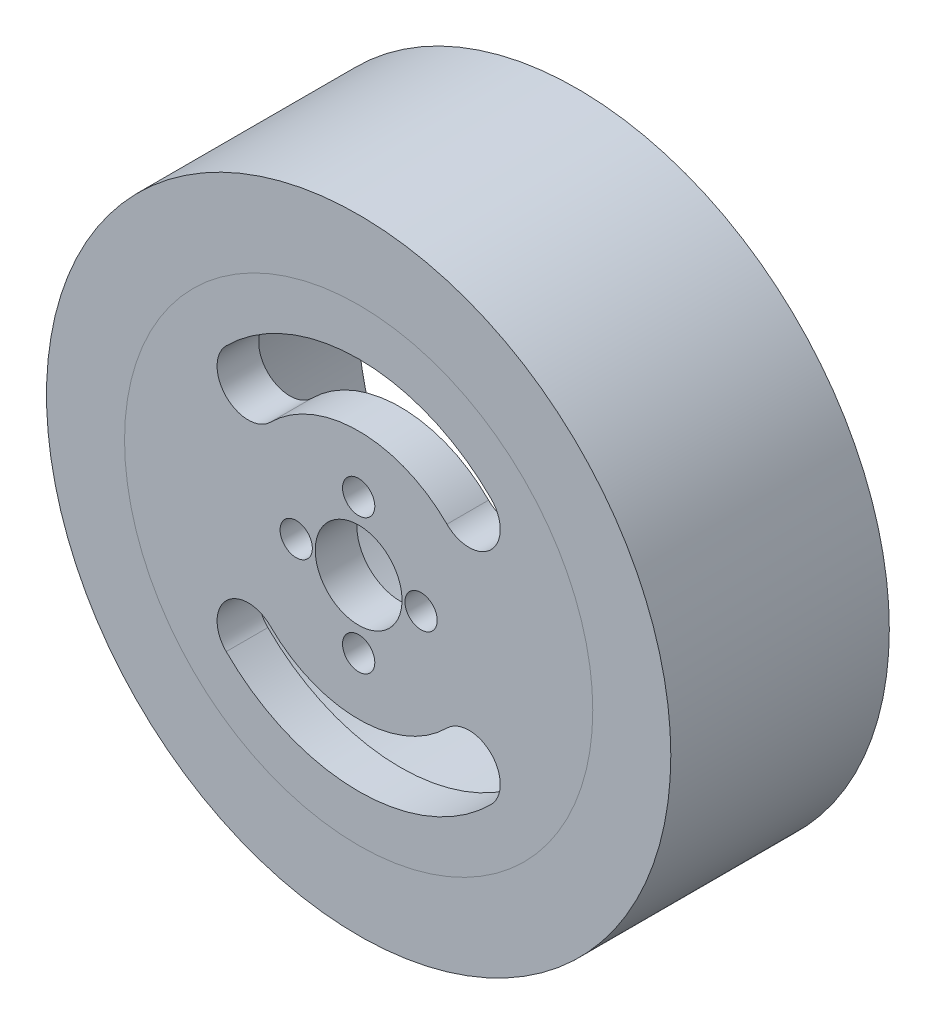
ISO-10303-21;
HEADER;
FILE_DESCRIPTION(('STEP AP214'),'2;1');
FILE_NAME('part.step','',(''),(''),'','','');
FILE_SCHEMA(('AUTOMOTIVE_DESIGN { 1 0 10303 214 1 1 1 1 }'));
ENDSEC;
DATA;
#1=APPLICATION_CONTEXT('core data for automotive mechanical design processes');
#2=APPLICATION_PROTOCOL_DEFINITION('international standard','automotive_design',2000,#1);
#3=PRODUCT_CONTEXT('',#1,'mechanical');
#4=PRODUCT('Part','Part','',(#3));
#5=PRODUCT_RELATED_PRODUCT_CATEGORY('part','',(#4));
#6=PRODUCT_DEFINITION_FORMATION('','',#4);
#7=PRODUCT_DEFINITION_CONTEXT('part definition',#1,'design');
#8=PRODUCT_DEFINITION('design','',#6,#7);
#9=PRODUCT_DEFINITION_SHAPE('','',#8);
#10=(LENGTH_UNIT() NAMED_UNIT(*) SI_UNIT(.MILLI.,.METRE.));
#11=(NAMED_UNIT(*) PLANE_ANGLE_UNIT() SI_UNIT($,.RADIAN.));
#12=(NAMED_UNIT(*) SI_UNIT($,.STERADIAN.) SOLID_ANGLE_UNIT());
#13=UNCERTAINTY_MEASURE_WITH_UNIT(LENGTH_MEASURE(1.E-05),#10,'distance_accuracy_value','');
#14=(GEOMETRIC_REPRESENTATION_CONTEXT(3) GLOBAL_UNCERTAINTY_ASSIGNED_CONTEXT((#13)) GLOBAL_UNIT_ASSIGNED_CONTEXT((#10,
#11,#12)) REPRESENTATION_CONTEXT('',''));
#15=CARTESIAN_POINT('',(0.,0.,0.));
#16=DIRECTION('',(0.,0.,1.));
#17=DIRECTION('',(1.,0.,0.));
#18=AXIS2_PLACEMENT_3D('',#15,#16,#17);
#19=CARTESIAN_POINT('',(0.,0.,-84.8528137423857));
#20=DIRECTION('',(0.,0.,1.));
#21=DIRECTION('',(1.,0.,0.));
#22=AXIS2_PLACEMENT_3D('',#19,#20,#21);
#23=CYLINDRICAL_SURFACE('',#22,30.);
#24=CARTESIAN_POINT('',(0.,0.,0.));
#25=DIRECTION('',(0.,0.,1.));
#26=DIRECTION('',(1.,0.,0.));
#27=AXIS2_PLACEMENT_3D('',#24,#25,#26);
#28=CIRCLE('',#27,30.);
#29=CARTESIAN_POINT('',(30.,0.,0.));
#30=VERTEX_POINT('',#29);
#31=EDGE_CURVE('E80',#30,#30,#28,.F.);
#32=ORIENTED_EDGE('',*,*,#31,.F.);
#33=EDGE_LOOP('',(#32));
#34=FACE_BOUND('',#33,.T.);
#35=CARTESIAN_POINT('',(0.,0.,21.));
#36=DIRECTION('',(0.,0.,1.));
#37=DIRECTION('',(1.,0.,0.));
#38=AXIS2_PLACEMENT_3D('',#35,#36,#37);
#39=CIRCLE('',#38,30.);
#40=CARTESIAN_POINT('',(30.,0.,21.));
#41=VERTEX_POINT('',#40);
#42=EDGE_CURVE('E84',#41,#41,#39,.T.);
#43=ORIENTED_EDGE('',*,*,#42,.F.);
#44=EDGE_LOOP('',(#43));
#45=FACE_BOUND('',#44,.T.);
#46=ADVANCED_FACE('F74',(#34,#45),#23,.T.);
#47=CARTESIAN_POINT('',(0.,0.,21.));
#48=DIRECTION('',(0.,0.,1.));
#49=DIRECTION('',(1.,0.,0.));
#50=AXIS2_PLACEMENT_3D('',#47,#48,#49);
#51=PLANE('',#50);
#52=CARTESIAN_POINT('',(0.,0.,21.));
#53=DIRECTION('',(0.,0.,1.));
#54=DIRECTION('',(1.,0.,0.));
#55=AXIS2_PLACEMENT_3D('',#52,#53,#54);
#56=CIRCLE('',#55,22.5);
#57=CARTESIAN_POINT('',(22.5,0.,21.));
#58=VERTEX_POINT('',#57);
#59=EDGE_CURVE('E89',#58,#58,#56,.T.);
#60=ORIENTED_EDGE('',*,*,#59,.F.);
#61=EDGE_LOOP('',(#60));
#62=FACE_BOUND('',#61,.T.);
#63=ORIENTED_EDGE('',*,*,#42,.T.);
#64=EDGE_LOOP('',(#63));
#65=FACE_BOUND('',#64,.T.);
#66=ADVANCED_FACE('F96',(#62,#65),#51,.T.);
#67=CARTESIAN_POINT('',(0.,0.,-84.8528137423857));
#68=DIRECTION('',(0.,0.,1.));
#69=DIRECTION('',(1.,0.,0.));
#70=AXIS2_PLACEMENT_3D('',#67,#68,#69);
#71=CYLINDRICAL_SURFACE('',#70,22.5);
#72=CARTESIAN_POINT('',(0.,0.,0.));
#73=DIRECTION('',(0.,0.,1.));
#74=DIRECTION('',(1.,0.,0.));
#75=AXIS2_PLACEMENT_3D('',#72,#73,#74);
#76=CIRCLE('',#75,22.5);
#77=CARTESIAN_POINT('',(22.5,0.,0.));
#78=VERTEX_POINT('',#77);
#79=EDGE_CURVE('E12',#78,#78,#76,.F.);
#80=ORIENTED_EDGE('',*,*,#79,.T.);
#81=EDGE_LOOP('',(#80));
#82=FACE_BOUND('',#81,.T.);
#83=ORIENTED_EDGE('',*,*,#59,.T.);
#84=EDGE_LOOP('',(#83));
#85=FACE_BOUND('',#84,.T.);
#86=ADVANCED_FACE('F94',(#82,#85),#71,.F.);
#87=CARTESIAN_POINT('',(0.,0.,0.));
#88=DIRECTION('',(0.,0.,1.));
#89=DIRECTION('',(1.,0.,0.));
#90=AXIS2_PLACEMENT_3D('',#87,#88,#89);
#91=PLANE('',#90);
#92=ORIENTED_EDGE('',*,*,#31,.T.);
#93=EDGE_LOOP('',(#92));
#94=FACE_BOUND('',#93,.T.);
#95=ORIENTED_EDGE('',*,*,#79,.F.);
#96=EDGE_LOOP('',(#95));
#97=FACE_BOUND('',#96,.T.);
#98=ADVANCED_FACE('F115',(#94,#97),#91,.F.);
#99=CLOSED_SHELL('',(#46,#66,#86,#98));
#100=MANIFOLD_SOLID_BREP('B2',#99);
#101=CARTESIAN_POINT('',(0.,0.,21.));
#102=DIRECTION('',(0.,0.,1.));
#103=DIRECTION('',(1.,0.,0.));
#104=AXIS2_PLACEMENT_3D('',#101,#102,#103);
#105=PLANE('',#104);
#106=CARTESIAN_POINT('',(0.,-6.5,21.));
#107=DIRECTION('',(0.,0.,-1.));
#108=DIRECTION('',(-1.,0.,0.));
#109=AXIS2_PLACEMENT_3D('',#106,#107,#108);
#110=CIRCLE('',#109,1.55);
#111=CARTESIAN_POINT('',(-1.55,-6.5,21.));
#112=VERTEX_POINT('',#111);
#113=EDGE_CURVE('E241',#112,#112,#110,.T.);
#114=ORIENTED_EDGE('',*,*,#113,.T.);
#115=EDGE_LOOP('',(#114));
#116=FACE_BOUND('',#115,.T.);
#117=CARTESIAN_POINT('',(0.,0.,21.));
#118=DIRECTION('',(0.,0.,-1.));
#119=DIRECTION('',(-1.,0.,0.));
#120=AXIS2_PLACEMENT_3D('',#117,#118,#119);
#121=CIRCLE('',#120,4.17);
#122=CARTESIAN_POINT('',(-4.17,0.,21.));
#123=VERTEX_POINT('',#122);
#124=EDGE_CURVE('E262',#123,#123,#121,.T.);
#125=ORIENTED_EDGE('',*,*,#124,.T.);
#126=EDGE_LOOP('',(#125));
#127=FACE_BOUND('',#126,.T.);
#128=CARTESIAN_POINT('',(-6.,0.,21.));
#129=DIRECTION('',(0.,0.,-1.));
#130=DIRECTION('',(-1.,0.,0.));
#131=AXIS2_PLACEMENT_3D('',#128,#129,#130);
#132=CIRCLE('',#131,1.55);
#133=CARTESIAN_POINT('',(-7.55,0.,21.));
#134=VERTEX_POINT('',#133);
#135=EDGE_CURVE('E380',#134,#134,#132,.T.);
#136=ORIENTED_EDGE('',*,*,#135,.T.);
#137=EDGE_LOOP('',(#136));
#138=FACE_BOUND('',#137,.T.);
#139=CARTESIAN_POINT('',(0.,6.5,21.));
#140=DIRECTION('',(0.,0.,-1.));
#141=DIRECTION('',(-1.,0.,0.));
#142=AXIS2_PLACEMENT_3D('',#139,#140,#141);
#143=CIRCLE('',#142,1.55);
#144=CARTESIAN_POINT('',(-1.55,6.5,21.));
#145=VERTEX_POINT('',#144);
#146=EDGE_CURVE('E363',#145,#145,#143,.T.);
#147=ORIENTED_EDGE('',*,*,#146,.T.);
#148=EDGE_LOOP('',(#147));
#149=FACE_BOUND('',#148,.T.);
#150=CARTESIAN_POINT('',(6.,0.,21.));
#151=DIRECTION('',(0.,0.,-1.));
#152=DIRECTION('',(-1.,0.,0.));
#153=AXIS2_PLACEMENT_3D('',#150,#151,#152);
#154=CIRCLE('',#153,1.55);
#155=CARTESIAN_POINT('',(4.45,0.,21.));
#156=VERTEX_POINT('',#155);
#157=EDGE_CURVE('E368',#156,#156,#154,.T.);
#158=ORIENTED_EDGE('',*,*,#157,.T.);
#159=EDGE_LOOP('',(#158));
#160=FACE_BOUND('',#159,.T.);
#161=CARTESIAN_POINT('',(0.,0.,21.));
#162=DIRECTION('',(0.,0.,1.));
#163=DIRECTION('',(1.,0.,0.));
#164=AXIS2_PLACEMENT_3D('',#161,#162,#163);
#165=CIRCLE('',#164,22.5);
#166=CARTESIAN_POINT('',(-22.5,0.,21.));
#167=VERTEX_POINT('',#166);
#168=EDGE_CURVE('E72',#167,#167,#165,.T.);
#169=ORIENTED_EDGE('',*,*,#168,.T.);
#170=EDGE_LOOP('',(#169));
#171=FACE_BOUND('',#170,.T.);
#172=CARTESIAN_POINT('',(-10.6066017177982,10.6066017177982,21.));
#173=DIRECTION('',(0.,0.,-1.));
#174=DIRECTION('',(-1.,0.,0.));
#175=AXIS2_PLACEMENT_3D('',#172,#173,#174);
#176=CIRCLE('',#175,3.);
#177=CARTESIAN_POINT('',(-8.48528137423857,8.48528137423857,21.));
#178=VERTEX_POINT('',#177);
#179=CARTESIAN_POINT('',(-12.7279220613579,12.7279220613579,21.));
#180=VERTEX_POINT('',#179);
#181=EDGE_CURVE('E254',#178,#180,#176,.T.);
#182=ORIENTED_EDGE('',*,*,#181,.T.);
#183=CARTESIAN_POINT('',(0.,0.,21.));
#184=DIRECTION('',(0.,0.,-1.));
#185=DIRECTION('',(-1.,0.,0.));
#186=AXIS2_PLACEMENT_3D('',#183,#184,#185);
#187=CIRCLE('',#186,18.);
#188=CARTESIAN_POINT('',(12.7279220613579,12.7279220613579,21.));
#189=VERTEX_POINT('',#188);
#190=EDGE_CURVE('E247',#189,#180,#187,.F.);
#191=ORIENTED_EDGE('',*,*,#190,.F.);
#192=CARTESIAN_POINT('',(10.6066017177982,10.6066017177982,21.));
#193=DIRECTION('',(0.,0.,-1.));
#194=DIRECTION('',(-1.,0.,0.));
#195=AXIS2_PLACEMENT_3D('',#192,#193,#194);
#196=CIRCLE('',#195,3.);
#197=CARTESIAN_POINT('',(8.48528137423857,8.48528137423857,21.));
#198=VERTEX_POINT('',#197);
#199=EDGE_CURVE('E249',#189,#198,#196,.T.);
#200=ORIENTED_EDGE('',*,*,#199,.T.);
#201=CARTESIAN_POINT('',(0.,0.,21.));
#202=DIRECTION('',(0.,0.,-1.));
#203=DIRECTION('',(-1.,0.,0.));
#204=AXIS2_PLACEMENT_3D('',#201,#202,#203);
#205=CIRCLE('',#204,12.);
#206=EDGE_CURVE('E158',#198,#178,#205,.F.);
#207=ORIENTED_EDGE('',*,*,#206,.T.);
#208=EDGE_LOOP('',(#182,#191,#200,#207));
#209=FACE_BOUND('',#208,.T.);
#210=CARTESIAN_POINT('',(0.,0.,21.));
#211=DIRECTION('',(0.,0.,-1.));
#212=DIRECTION('',(-1.,0.,0.));
#213=AXIS2_PLACEMENT_3D('',#210,#211,#212);
#214=CIRCLE('',#213,12.);
#215=CARTESIAN_POINT('',(8.48528137423857,-8.48528137423857,21.));
#216=VERTEX_POINT('',#215);
#217=CARTESIAN_POINT('',(-8.48528137423856,-8.48528137423857,21.));
#218=VERTEX_POINT('',#217);
#219=EDGE_CURVE('E209',#216,#218,#214,.T.);
#220=ORIENTED_EDGE('',*,*,#219,.F.);
#221=CARTESIAN_POINT('',(10.6066017177982,-10.6066017177982,21.));
#222=DIRECTION('',(0.,0.,-1.));
#223=DIRECTION('',(-1.,0.,0.));
#224=AXIS2_PLACEMENT_3D('',#221,#222,#223);
#225=CIRCLE('',#224,3.);
#226=CARTESIAN_POINT('',(12.7279220613578,-12.7279220613578,21.));
#227=VERTEX_POINT('',#226);
#228=EDGE_CURVE('E204',#227,#216,#225,.F.);
#229=ORIENTED_EDGE('',*,*,#228,.F.);
#230=CARTESIAN_POINT('',(0.,0.,21.));
#231=DIRECTION('',(0.,0.,-1.));
#232=DIRECTION('',(-1.,0.,0.));
#233=AXIS2_PLACEMENT_3D('',#230,#231,#232);
#234=CIRCLE('',#233,18.);
#235=CARTESIAN_POINT('',(-12.7279220613578,-12.7279220613579,21.));
#236=VERTEX_POINT('',#235);
#237=EDGE_CURVE('E212',#227,#236,#234,.T.);
#238=ORIENTED_EDGE('',*,*,#237,.T.);
#239=CARTESIAN_POINT('',(-10.6066017177982,-10.6066017177982,21.));
#240=DIRECTION('',(0.,0.,-1.));
#241=DIRECTION('',(-1.,0.,0.));
#242=AXIS2_PLACEMENT_3D('',#239,#240,#241);
#243=CIRCLE('',#242,3.);
#244=EDGE_CURVE('E216',#218,#236,#243,.F.);
#245=ORIENTED_EDGE('',*,*,#244,.F.);
#246=EDGE_LOOP('',(#220,#229,#238,#245));
#247=FACE_BOUND('',#246,.T.);
#248=ADVANCED_FACE('F135',(#116,#127,#138,#149,#160,#171,#209,#247),#105,.T.);
#249=CARTESIAN_POINT('',(0.,0.,17.));
#250=DIRECTION('',(0.,0.,-1.));
#251=DIRECTION('',(-1.,0.,0.));
#252=AXIS2_PLACEMENT_3D('',#249,#250,#251);
#253=PLANE('',#252);
#254=CARTESIAN_POINT('',(0.,0.,17.));
#255=DIRECTION('',(0.,0.,-1.));
#256=DIRECTION('',(-1.,0.,0.));
#257=AXIS2_PLACEMENT_3D('',#254,#255,#256);
#258=CIRCLE('',#257,4.17);
#259=CARTESIAN_POINT('',(-4.17,0.,17.));
#260=VERTEX_POINT('',#259);
#261=EDGE_CURVE('E378',#260,#260,#258,.T.);
#262=ORIENTED_EDGE('',*,*,#261,.F.);
#263=EDGE_LOOP('',(#262));
#264=FACE_BOUND('',#263,.T.);
#265=CARTESIAN_POINT('',(0.,-6.5,17.));
#266=DIRECTION('',(0.,0.,-1.));
#267=DIRECTION('',(-1.,0.,0.));
#268=AXIS2_PLACEMENT_3D('',#265,#266,#267);
#269=CIRCLE('',#268,1.55);
#270=CARTESIAN_POINT('',(-1.55,-6.5,17.));
#271=VERTEX_POINT('',#270);
#272=EDGE_CURVE('E237',#271,#271,#269,.T.);
#273=ORIENTED_EDGE('',*,*,#272,.F.);
#274=EDGE_LOOP('',(#273));
#275=FACE_BOUND('',#274,.T.);
#276=CARTESIAN_POINT('',(-6.,0.,17.));
#277=DIRECTION('',(0.,0.,-1.));
#278=DIRECTION('',(-1.,0.,0.));
#279=AXIS2_PLACEMENT_3D('',#276,#277,#278);
#280=CIRCLE('',#279,1.55);
#281=CARTESIAN_POINT('',(-7.55,0.,17.));
#282=VERTEX_POINT('',#281);
#283=EDGE_CURVE('E225',#282,#282,#280,.T.);
#284=ORIENTED_EDGE('',*,*,#283,.F.);
#285=EDGE_LOOP('',(#284));
#286=FACE_BOUND('',#285,.T.);
#287=CARTESIAN_POINT('',(0.,6.5,17.));
#288=DIRECTION('',(0.,0.,-1.));
#289=DIRECTION('',(-1.,0.,0.));
#290=AXIS2_PLACEMENT_3D('',#287,#288,#289);
#291=CIRCLE('',#290,1.55);
#292=CARTESIAN_POINT('',(-1.55,6.5,17.));
#293=VERTEX_POINT('',#292);
#294=EDGE_CURVE('E366',#293,#293,#291,.T.);
#295=ORIENTED_EDGE('',*,*,#294,.F.);
#296=EDGE_LOOP('',(#295));
#297=FACE_BOUND('',#296,.T.);
#298=CARTESIAN_POINT('',(6.,0.,17.));
#299=DIRECTION('',(0.,0.,-1.));
#300=DIRECTION('',(-1.,0.,0.));
#301=AXIS2_PLACEMENT_3D('',#298,#299,#300);
#302=CIRCLE('',#301,1.55);
#303=CARTESIAN_POINT('',(4.45,0.,17.));
#304=VERTEX_POINT('',#303);
#305=EDGE_CURVE('E244',#304,#304,#302,.T.);
#306=ORIENTED_EDGE('',*,*,#305,.F.);
#307=EDGE_LOOP('',(#306));
#308=FACE_BOUND('',#307,.T.);
#309=CARTESIAN_POINT('',(0.,0.,17.));
#310=DIRECTION('',(0.,0.,-1.));
#311=DIRECTION('',(-1.,0.,0.));
#312=AXIS2_PLACEMENT_3D('',#309,#310,#311);
#313=CIRCLE('',#312,21.);
#314=CARTESIAN_POINT('',(-21.,0.,17.));
#315=VERTEX_POINT('',#314);
#316=EDGE_CURVE('E279',#315,#315,#313,.T.);
#317=ORIENTED_EDGE('',*,*,#316,.T.);
#318=EDGE_LOOP('',(#317));
#319=FACE_BOUND('',#318,.T.);
#320=CARTESIAN_POINT('',(10.6066017177982,10.6066017177982,17.));
#321=DIRECTION('',(0.,0.,-1.));
#322=DIRECTION('',(-1.,0.,0.));
#323=AXIS2_PLACEMENT_3D('',#320,#321,#322);
#324=CIRCLE('',#323,3.);
#325=CARTESIAN_POINT('',(12.7279220613579,12.7279220613579,17.));
#326=VERTEX_POINT('',#325);
#327=CARTESIAN_POINT('',(8.48528137423857,8.48528137423857,17.));
#328=VERTEX_POINT('',#327);
#329=EDGE_CURVE('E261',#326,#328,#324,.T.);
#330=ORIENTED_EDGE('',*,*,#329,.F.);
#331=CARTESIAN_POINT('',(0.,0.,17.));
#332=DIRECTION('',(0.,0.,-1.));
#333=DIRECTION('',(-1.,0.,0.));
#334=AXIS2_PLACEMENT_3D('',#331,#332,#333);
#335=CIRCLE('',#334,18.);
#336=CARTESIAN_POINT('',(-12.7279220613579,12.7279220613579,17.));
#337=VERTEX_POINT('',#336);
#338=EDGE_CURVE('E258',#326,#337,#335,.F.);
#339=ORIENTED_EDGE('',*,*,#338,.T.);
#340=CARTESIAN_POINT('',(-10.6066017177982,10.6066017177982,17.));
#341=DIRECTION('',(0.,0.,-1.));
#342=DIRECTION('',(-1.,0.,0.));
#343=AXIS2_PLACEMENT_3D('',#340,#341,#342);
#344=CIRCLE('',#343,3.);
#345=CARTESIAN_POINT('',(-8.48528137423857,8.48528137423857,17.));
#346=VERTEX_POINT('',#345);
#347=EDGE_CURVE('E250',#346,#337,#344,.T.);
#348=ORIENTED_EDGE('',*,*,#347,.F.);
#349=CARTESIAN_POINT('',(0.,0.,17.));
#350=DIRECTION('',(0.,0.,-1.));
#351=DIRECTION('',(-1.,0.,0.));
#352=AXIS2_PLACEMENT_3D('',#349,#350,#351);
#353=CIRCLE('',#352,12.);
#354=EDGE_CURVE('E265',#328,#346,#353,.F.);
#355=ORIENTED_EDGE('',*,*,#354,.F.);
#356=EDGE_LOOP('',(#330,#339,#348,#355));
#357=FACE_BOUND('',#356,.T.);
#358=CARTESIAN_POINT('',(0.,0.,17.));
#359=DIRECTION('',(0.,0.,-1.));
#360=DIRECTION('',(-1.,0.,0.));
#361=AXIS2_PLACEMENT_3D('',#358,#359,#360);
#362=CIRCLE('',#361,18.);
#363=CARTESIAN_POINT('',(12.7279220613578,-12.7279220613579,17.));
#364=VERTEX_POINT('',#363);
#365=CARTESIAN_POINT('',(-12.7279220613578,-12.7279220613579,17.));
#366=VERTEX_POINT('',#365);
#367=EDGE_CURVE('E231',#364,#366,#362,.T.);
#368=ORIENTED_EDGE('',*,*,#367,.F.);
#369=CARTESIAN_POINT('',(10.6066017177982,-10.6066017177982,17.));
#370=DIRECTION('',(0.,0.,-1.));
#371=DIRECTION('',(-1.,0.,0.));
#372=AXIS2_PLACEMENT_3D('',#369,#370,#371);
#373=CIRCLE('',#372,3.);
#374=CARTESIAN_POINT('',(8.48528137423857,-8.48528137423857,17.));
#375=VERTEX_POINT('',#374);
#376=EDGE_CURVE('E207',#364,#375,#373,.F.);
#377=ORIENTED_EDGE('',*,*,#376,.T.);
#378=CARTESIAN_POINT('',(0.,0.,17.));
#379=DIRECTION('',(0.,0.,-1.));
#380=DIRECTION('',(-1.,0.,0.));
#381=AXIS2_PLACEMENT_3D('',#378,#379,#380);
#382=CIRCLE('',#381,12.);
#383=CARTESIAN_POINT('',(-8.48528137423856,-8.48528137423857,17.));
#384=VERTEX_POINT('',#383);
#385=EDGE_CURVE('E219',#375,#384,#382,.T.);
#386=ORIENTED_EDGE('',*,*,#385,.T.);
#387=CARTESIAN_POINT('',(-10.6066017177982,-10.6066017177982,17.));
#388=DIRECTION('',(0.,0.,-1.));
#389=DIRECTION('',(-1.,0.,0.));
#390=AXIS2_PLACEMENT_3D('',#387,#388,#389);
#391=CIRCLE('',#390,3.);
#392=EDGE_CURVE('E222',#384,#366,#391,.F.);
#393=ORIENTED_EDGE('',*,*,#392,.T.);
#394=EDGE_LOOP('',(#368,#377,#386,#393));
#395=FACE_BOUND('',#394,.T.);
#396=ADVANCED_FACE('F294',(#264,#275,#286,#297,#308,#319,#357,#395),#253,.T.);
#397=CARTESIAN_POINT('',(0.,0.,21.));
#398=DIRECTION('',(0.,0.,-1.));
#399=DIRECTION('',(-1.,0.,0.));
#400=AXIS2_PLACEMENT_3D('',#397,#398,#399);
#401=CYLINDRICAL_SURFACE('',#400,22.5);
#402=CARTESIAN_POINT('',(0.,0.,0.));
#403=DIRECTION('',(0.,0.,1.));
#404=DIRECTION('',(1.,0.,0.));
#405=AXIS2_PLACEMENT_3D('',#402,#403,#404);
#406=CIRCLE('',#405,22.5);
#407=CARTESIAN_POINT('',(-22.5,0.,0.));
#408=VERTEX_POINT('',#407);
#409=EDGE_CURVE('E139',#408,#408,#406,.T.);
#410=CARTESIAN_POINT('',(-22.5,0.,21.));
#411=CARTESIAN_POINT('',(-22.5,0.,20.78125));
#412=CARTESIAN_POINT('',(-22.5,0.,20.5625));
#413=CARTESIAN_POINT('',(-22.5,0.,20.125));
#414=CARTESIAN_POINT('',(-22.5,0.,19.90625));
#415=CARTESIAN_POINT('',(-22.5,0.,19.46875));
#416=CARTESIAN_POINT('',(-22.5,0.,19.25));
#417=CARTESIAN_POINT('',(-22.5,0.,18.8125));
#418=CARTESIAN_POINT('',(-22.5,0.,18.59375));
#419=CARTESIAN_POINT('',(-22.5,0.,18.15625));
#420=CARTESIAN_POINT('',(-22.5,0.,17.9375));
#421=CARTESIAN_POINT('',(-22.5,0.,17.5));
#422=CARTESIAN_POINT('',(-22.5,0.,17.28125));
#423=CARTESIAN_POINT('',(-22.5,0.,16.84375));
#424=CARTESIAN_POINT('',(-22.5,0.,16.625));
#425=CARTESIAN_POINT('',(-22.5,0.,16.1875));
#426=CARTESIAN_POINT('',(-22.5,0.,15.96875));
#427=CARTESIAN_POINT('',(-22.5,0.,15.53125));
#428=CARTESIAN_POINT('',(-22.5,0.,15.3125));
#429=CARTESIAN_POINT('',(-22.5,0.,14.875));
#430=CARTESIAN_POINT('',(-22.5,0.,14.65625));
#431=CARTESIAN_POINT('',(-22.5,0.,14.21875));
#432=CARTESIAN_POINT('',(-22.5,0.,14.));
#433=CARTESIAN_POINT('',(-22.5,0.,13.5625));
#434=CARTESIAN_POINT('',(-22.5,0.,13.34375));
#435=CARTESIAN_POINT('',(-22.5,0.,12.90625));
#436=CARTESIAN_POINT('',(-22.5,0.,12.6875));
#437=CARTESIAN_POINT('',(-22.5,0.,12.25));
#438=CARTESIAN_POINT('',(-22.5,0.,12.03125));
#439=CARTESIAN_POINT('',(-22.5,0.,11.59375));
#440=CARTESIAN_POINT('',(-22.5,0.,11.375));
#441=CARTESIAN_POINT('',(-22.5,0.,10.9375));
#442=CARTESIAN_POINT('',(-22.5,0.,10.71875));
#443=CARTESIAN_POINT('',(-22.5,0.,10.28125));
#444=CARTESIAN_POINT('',(-22.5,0.,10.0625));
#445=CARTESIAN_POINT('',(-22.5,0.,9.625));
#446=CARTESIAN_POINT('',(-22.5,0.,9.40625));
#447=CARTESIAN_POINT('',(-22.5,0.,8.96875));
#448=CARTESIAN_POINT('',(-22.5,0.,8.75));
#449=CARTESIAN_POINT('',(-22.5,0.,8.3125));
#450=CARTESIAN_POINT('',(-22.5,0.,8.09375));
#451=CARTESIAN_POINT('',(-22.5,0.,7.65625));
#452=CARTESIAN_POINT('',(-22.5,0.,7.4375));
#453=CARTESIAN_POINT('',(-22.5,0.,7.));
#454=CARTESIAN_POINT('',(-22.5,0.,6.78125));
#455=CARTESIAN_POINT('',(-22.5,0.,6.34375));
#456=CARTESIAN_POINT('',(-22.5,0.,6.125));
#457=CARTESIAN_POINT('',(-22.5,0.,5.6875));
#458=CARTESIAN_POINT('',(-22.5,0.,5.46875));
#459=CARTESIAN_POINT('',(-22.5,0.,5.03125));
#460=CARTESIAN_POINT('',(-22.5,0.,4.8125));
#461=CARTESIAN_POINT('',(-22.5,0.,4.375));
#462=CARTESIAN_POINT('',(-22.5,0.,4.15625));
#463=CARTESIAN_POINT('',(-22.5,0.,3.71875));
#464=CARTESIAN_POINT('',(-22.5,0.,3.5));
#465=CARTESIAN_POINT('',(-22.5,0.,3.0625));
#466=CARTESIAN_POINT('',(-22.5,0.,2.84375));
#467=CARTESIAN_POINT('',(-22.5,0.,2.40625));
#468=CARTESIAN_POINT('',(-22.5,0.,2.1875));
#469=CARTESIAN_POINT('',(-22.5,0.,1.75));
#470=CARTESIAN_POINT('',(-22.5,0.,1.53125));
#471=CARTESIAN_POINT('',(-22.5,0.,1.09375));
#472=CARTESIAN_POINT('',(-22.5,0.,0.875000000000001));
#473=CARTESIAN_POINT('',(-22.5,0.,0.4375));
#474=CARTESIAN_POINT('',(-22.5,0.,0.21875));
#475=CARTESIAN_POINT('',(-22.5,0.,0.));
#476=B_SPLINE_CURVE_WITH_KNOTS('',3,(#410,#411,#412,#413,#414,#415,#416,#417,#418,#419,#420,
#421,#422,#423,#424,#425,#426,#427,#428,#429,#430,#431,#432,#433,#434,#435,#436,#437,#438,#439,
#440,#441,#442,#443,#444,#445,#446,#447,#448,#449,#450,#451,#452,#453,#454,#455,#456,#457,#458,
#459,#460,#461,#462,#463,#464,#465,#466,#467,#468,#469,#470,#471,#472,#473,#474,#475),
.UNSPECIFIED.,.F.,.F.,(4,2,2,2,2,2,2,2,2,2,2,2,2,2,2,2,2,2,2,2,2,2,2,2,2,2,2,2,2,2,2,2,4),(0.,
0.656250000000001,1.3125,1.96875,2.625,3.28125,3.9375,4.59375,5.25,5.90625,6.5625,7.21875,7.875,
8.53125,9.1875,9.84375,10.5,11.15625,11.8125,12.46875,13.125,13.78125,14.4375,15.09375,15.75,
16.40625,17.0625,17.71875,18.375,19.03125,19.6875,20.34375,21.),.UNSPECIFIED.);
#477=EDGE_CURVE('BSEAM137',#167,#408,#476,.T.);
#478=ORIENTED_EDGE('',*,*,#168,.F.);
#479=ORIENTED_EDGE('',*,*,#409,.T.);
#480=ORIENTED_EDGE('',*,*,#477,.T.);
#481=ORIENTED_EDGE('',*,*,#477,.F.);
#482=EDGE_LOOP('',(#478,#480,#479,#481));
#483=FACE_BOUND('',#482,.T.);
#484=ADVANCED_FACE('F137',(#483),#401,.T.);
#485=CARTESIAN_POINT('',(0.,0.,0.));
#486=DIRECTION('',(0.,0.,1.));
#487=DIRECTION('',(1.,0.,0.));
#488=AXIS2_PLACEMENT_3D('',#485,#486,#487);
#489=PLANE('',#488);
#490=CARTESIAN_POINT('',(0.,0.,0.));
#491=DIRECTION('',(0.,0.,-1.));
#492=DIRECTION('',(-1.,0.,0.));
#493=AXIS2_PLACEMENT_3D('',#490,#491,#492);
#494=CIRCLE('',#493,21.);
#495=CARTESIAN_POINT('',(-21.,0.,0.));
#496=VERTEX_POINT('',#495);
#497=EDGE_CURVE('E272',#496,#496,#494,.T.);
#498=ORIENTED_EDGE('',*,*,#497,.F.);
#499=EDGE_LOOP('',(#498));
#500=FACE_BOUND('',#499,.T.);
#501=ORIENTED_EDGE('',*,*,#409,.F.);
#502=EDGE_LOOP('',(#501));
#503=FACE_BOUND('',#502,.T.);
#504=ADVANCED_FACE('F287',(#500,#503),#489,.F.);
#505=CARTESIAN_POINT('',(0.,0.,17.));
#506=DIRECTION('',(0.,0.,-1.));
#507=DIRECTION('',(-1.,0.,0.));
#508=AXIS2_PLACEMENT_3D('',#505,#506,#507);
#509=CYLINDRICAL_SURFACE('',#508,21.);
#510=ORIENTED_EDGE('',*,*,#316,.F.);
#511=EDGE_LOOP('',(#510));
#512=FACE_BOUND('',#511,.T.);
#513=ORIENTED_EDGE('',*,*,#497,.T.);
#514=EDGE_LOOP('',(#513));
#515=FACE_BOUND('',#514,.T.);
#516=ADVANCED_FACE('F285',(#512,#515),#509,.F.);
#517=CARTESIAN_POINT('',(0.,0.,21.));
#518=DIRECTION('',(0.,0.,-1.));
#519=DIRECTION('',(-1.,0.,0.));
#520=AXIS2_PLACEMENT_3D('',#517,#518,#519);
#521=CYLINDRICAL_SURFACE('',#520,18.);
#522=ORIENTED_EDGE('',*,*,#338,.F.);
#523=DIRECTION('',(0.,0.,-1.));
#524=VECTOR('',#523,1.);
#525=CARTESIAN_POINT('',(12.7279220613579,12.7279220613579,21.));
#526=LINE('',#525,#524);
#527=EDGE_CURVE('E257',#189,#326,#526,.T.);
#528=ORIENTED_EDGE('',*,*,#527,.F.);
#529=ORIENTED_EDGE('',*,*,#190,.T.);
#530=DIRECTION('',(0.,0.,-1.));
#531=VECTOR('',#530,1.);
#532=CARTESIAN_POINT('',(-12.7279220613579,12.7279220613579,21.));
#533=LINE('',#532,#531);
#534=EDGE_CURVE('E270',#180,#337,#533,.T.);
#535=ORIENTED_EDGE('',*,*,#534,.T.);
#536=EDGE_LOOP('',(#522,#528,#529,#535));
#537=FACE_BOUND('',#536,.T.);
#538=ADVANCED_FACE('F310',(#537),#521,.F.);
#539=CARTESIAN_POINT('',(-10.6066017177982,10.6066017177982,21.));
#540=DIRECTION('',(0.,0.,-1.));
#541=DIRECTION('',(-1.,0.,0.));
#542=AXIS2_PLACEMENT_3D('',#539,#540,#541);
#543=CYLINDRICAL_SURFACE('',#542,3.);
#544=ORIENTED_EDGE('',*,*,#347,.T.);
#545=ORIENTED_EDGE('',*,*,#534,.F.);
#546=ORIENTED_EDGE('',*,*,#181,.F.);
#547=DIRECTION('',(0.,0.,-1.));
#548=VECTOR('',#547,1.);
#549=CARTESIAN_POINT('',(-8.48528137423857,8.48528137423857,21.));
#550=LINE('',#549,#548);
#551=EDGE_CURVE('E273',#178,#346,#550,.T.);
#552=ORIENTED_EDGE('',*,*,#551,.T.);
#553=EDGE_LOOP('',(#544,#545,#546,#552));
#554=FACE_BOUND('',#553,.T.);
#555=ADVANCED_FACE('F315',(#554),#543,.F.);
#556=CARTESIAN_POINT('',(0.,0.,21.));
#557=DIRECTION('',(0.,0.,-1.));
#558=DIRECTION('',(-1.,0.,0.));
#559=AXIS2_PLACEMENT_3D('',#556,#557,#558);
#560=CYLINDRICAL_SURFACE('',#559,12.);
#561=ORIENTED_EDGE('',*,*,#354,.T.);
#562=ORIENTED_EDGE('',*,*,#551,.F.);
#563=ORIENTED_EDGE('',*,*,#206,.F.);
#564=DIRECTION('',(0.,0.,-1.));
#565=VECTOR('',#564,1.);
#566=CARTESIAN_POINT('',(8.48528137423857,8.48528137423857,21.));
#567=LINE('',#566,#565);
#568=EDGE_CURVE('E275',#198,#328,#567,.T.);
#569=ORIENTED_EDGE('',*,*,#568,.T.);
#570=EDGE_LOOP('',(#561,#562,#563,#569));
#571=FACE_BOUND('',#570,.T.);
#572=ADVANCED_FACE('F321',(#571),#560,.T.);
#573=CARTESIAN_POINT('',(10.6066017177982,10.6066017177982,21.));
#574=DIRECTION('',(0.,0.,-1.));
#575=DIRECTION('',(-1.,0.,0.));
#576=AXIS2_PLACEMENT_3D('',#573,#574,#575);
#577=CYLINDRICAL_SURFACE('',#576,3.);
#578=ORIENTED_EDGE('',*,*,#329,.T.);
#579=ORIENTED_EDGE('',*,*,#568,.F.);
#580=ORIENTED_EDGE('',*,*,#199,.F.);
#581=ORIENTED_EDGE('',*,*,#527,.T.);
#582=EDGE_LOOP('',(#578,#579,#580,#581));
#583=FACE_BOUND('',#582,.T.);
#584=ADVANCED_FACE('F317',(#583),#577,.F.);
#585=CARTESIAN_POINT('',(6.,0.,21.));
#586=DIRECTION('',(0.,0.,-1.));
#587=DIRECTION('',(-1.,0.,0.));
#588=AXIS2_PLACEMENT_3D('',#585,#586,#587);
#589=CYLINDRICAL_SURFACE('',#588,1.55);
#590=ORIENTED_EDGE('',*,*,#157,.F.);
#591=EDGE_LOOP('',(#590));
#592=FACE_BOUND('',#591,.T.);
#593=ORIENTED_EDGE('',*,*,#305,.T.);
#594=EDGE_LOOP('',(#593));
#595=FACE_BOUND('',#594,.T.);
#596=ADVANCED_FACE('F320',(#592,#595),#589,.F.);
#597=CARTESIAN_POINT('',(0.,6.5,21.));
#598=DIRECTION('',(0.,0.,-1.));
#599=DIRECTION('',(-1.,0.,0.));
#600=AXIS2_PLACEMENT_3D('',#597,#598,#599);
#601=CYLINDRICAL_SURFACE('',#600,1.55);
#602=ORIENTED_EDGE('',*,*,#146,.F.);
#603=EDGE_LOOP('',(#602));
#604=FACE_BOUND('',#603,.T.);
#605=ORIENTED_EDGE('',*,*,#294,.T.);
#606=EDGE_LOOP('',(#605));
#607=FACE_BOUND('',#606,.T.);
#608=ADVANCED_FACE('F348',(#604,#607),#601,.F.);
#609=CARTESIAN_POINT('',(-6.,0.,21.));
#610=DIRECTION('',(0.,0.,-1.));
#611=DIRECTION('',(-1.,0.,0.));
#612=AXIS2_PLACEMENT_3D('',#609,#610,#611);
#613=CYLINDRICAL_SURFACE('',#612,1.55);
#614=ORIENTED_EDGE('',*,*,#135,.F.);
#615=EDGE_LOOP('',(#614));
#616=FACE_BOUND('',#615,.T.);
#617=ORIENTED_EDGE('',*,*,#283,.T.);
#618=EDGE_LOOP('',(#617));
#619=FACE_BOUND('',#618,.T.);
#620=ADVANCED_FACE('F336',(#616,#619),#613,.F.);
#621=CARTESIAN_POINT('',(10.6066017177982,-10.6066017177982,21.));
#622=DIRECTION('',(0.,0.,-1.));
#623=DIRECTION('',(-1.,0.,0.));
#624=AXIS2_PLACEMENT_3D('',#621,#622,#623);
#625=CYLINDRICAL_SURFACE('',#624,3.);
#626=ORIENTED_EDGE('',*,*,#376,.F.);
#627=DIRECTION('',(0.,0.,-1.));
#628=VECTOR('',#627,1.);
#629=CARTESIAN_POINT('',(12.7279220613578,-12.7279220613578,21.));
#630=LINE('',#629,#628);
#631=EDGE_CURVE('E200',#227,#364,#630,.T.);
#632=ORIENTED_EDGE('',*,*,#631,.F.);
#633=ORIENTED_EDGE('',*,*,#228,.T.);
#634=DIRECTION('',(0.,0.,-1.));
#635=VECTOR('',#634,1.);
#636=CARTESIAN_POINT('',(8.48528137423857,-8.48528137423857,21.));
#637=LINE('',#636,#635);
#638=EDGE_CURVE('E235',#216,#375,#637,.T.);
#639=ORIENTED_EDGE('',*,*,#638,.T.);
#640=EDGE_LOOP('',(#626,#632,#633,#639));
#641=FACE_BOUND('',#640,.T.);
#642=ADVANCED_FACE('F201',(#641),#625,.F.);
#643=CARTESIAN_POINT('',(0.,0.,21.));
#644=DIRECTION('',(0.,0.,-1.));
#645=DIRECTION('',(-1.,0.,0.));
#646=AXIS2_PLACEMENT_3D('',#643,#644,#645);
#647=CYLINDRICAL_SURFACE('',#646,12.);
#648=ORIENTED_EDGE('',*,*,#385,.F.);
#649=ORIENTED_EDGE('',*,*,#638,.F.);
#650=ORIENTED_EDGE('',*,*,#219,.T.);
#651=DIRECTION('',(0.,0.,-1.));
#652=VECTOR('',#651,1.);
#653=CARTESIAN_POINT('',(-8.48528137423856,-8.48528137423857,21.));
#654=LINE('',#653,#652);
#655=EDGE_CURVE('E238',#218,#384,#654,.T.);
#656=ORIENTED_EDGE('',*,*,#655,.T.);
#657=EDGE_LOOP('',(#648,#649,#650,#656));
#658=FACE_BOUND('',#657,.T.);
#659=ADVANCED_FACE('F335',(#658),#647,.T.);
#660=CARTESIAN_POINT('',(-10.6066017177982,-10.6066017177982,21.));
#661=DIRECTION('',(0.,0.,-1.));
#662=DIRECTION('',(-1.,0.,0.));
#663=AXIS2_PLACEMENT_3D('',#660,#661,#662);
#664=CYLINDRICAL_SURFACE('',#663,3.);
#665=ORIENTED_EDGE('',*,*,#392,.F.);
#666=ORIENTED_EDGE('',*,*,#655,.F.);
#667=ORIENTED_EDGE('',*,*,#244,.T.);
#668=DIRECTION('',(0.,0.,-1.));
#669=VECTOR('',#668,1.);
#670=CARTESIAN_POINT('',(-12.7279220613578,-12.7279220613579,21.));
#671=LINE('',#670,#669);
#672=EDGE_CURVE('E150',#236,#366,#671,.T.);
#673=ORIENTED_EDGE('',*,*,#672,.T.);
#674=EDGE_LOOP('',(#665,#666,#667,#673));
#675=FACE_BOUND('',#674,.T.);
#676=ADVANCED_FACE('F339',(#675),#664,.F.);
#677=CARTESIAN_POINT('',(0.,0.,21.));
#678=DIRECTION('',(0.,0.,-1.));
#679=DIRECTION('',(-1.,0.,0.));
#680=AXIS2_PLACEMENT_3D('',#677,#678,#679);
#681=CYLINDRICAL_SURFACE('',#680,18.);
#682=ORIENTED_EDGE('',*,*,#367,.T.);
#683=ORIENTED_EDGE('',*,*,#672,.F.);
#684=ORIENTED_EDGE('',*,*,#237,.F.);
#685=ORIENTED_EDGE('',*,*,#631,.T.);
#686=EDGE_LOOP('',(#682,#683,#684,#685));
#687=FACE_BOUND('',#686,.T.);
#688=ADVANCED_FACE('F213',(#687),#681,.F.);
#689=CARTESIAN_POINT('',(0.,-6.5,21.));
#690=DIRECTION('',(0.,0.,-1.));
#691=DIRECTION('',(-1.,0.,0.));
#692=AXIS2_PLACEMENT_3D('',#689,#690,#691);
#693=CYLINDRICAL_SURFACE('',#692,1.55);
#694=ORIENTED_EDGE('',*,*,#113,.F.);
#695=EDGE_LOOP('',(#694));
#696=FACE_BOUND('',#695,.T.);
#697=ORIENTED_EDGE('',*,*,#272,.T.);
#698=EDGE_LOOP('',(#697));
#699=FACE_BOUND('',#698,.T.);
#700=ADVANCED_FACE('F328',(#696,#699),#693,.F.);
#701=CARTESIAN_POINT('',(0.,0.,21.));
#702=DIRECTION('',(0.,0.,-1.));
#703=DIRECTION('',(-1.,0.,0.));
#704=AXIS2_PLACEMENT_3D('',#701,#702,#703);
#705=CYLINDRICAL_SURFACE('',#704,4.17);
#706=ORIENTED_EDGE('',*,*,#124,.F.);
#707=EDGE_LOOP('',(#706));
#708=FACE_BOUND('',#707,.T.);
#709=ORIENTED_EDGE('',*,*,#261,.T.);
#710=EDGE_LOOP('',(#709));
#711=FACE_BOUND('',#710,.T.);
#712=ADVANCED_FACE('F331',(#708,#711),#705,.F.);
#713=CLOSED_SHELL('',(#248,#396,#484,#504,#516,#538,#555,#572,#584,#596,#608,#620,#642,#659,
#676,#688,#700,#712));
#714=MANIFOLD_SOLID_BREP('B7',#713);
#715=ADVANCED_BREP_SHAPE_REPRESENTATION('',(#18,#100,#714),#14);
#716=SHAPE_DEFINITION_REPRESENTATION(#9,#715);
ENDSEC;
END-ISO-10303-21;
